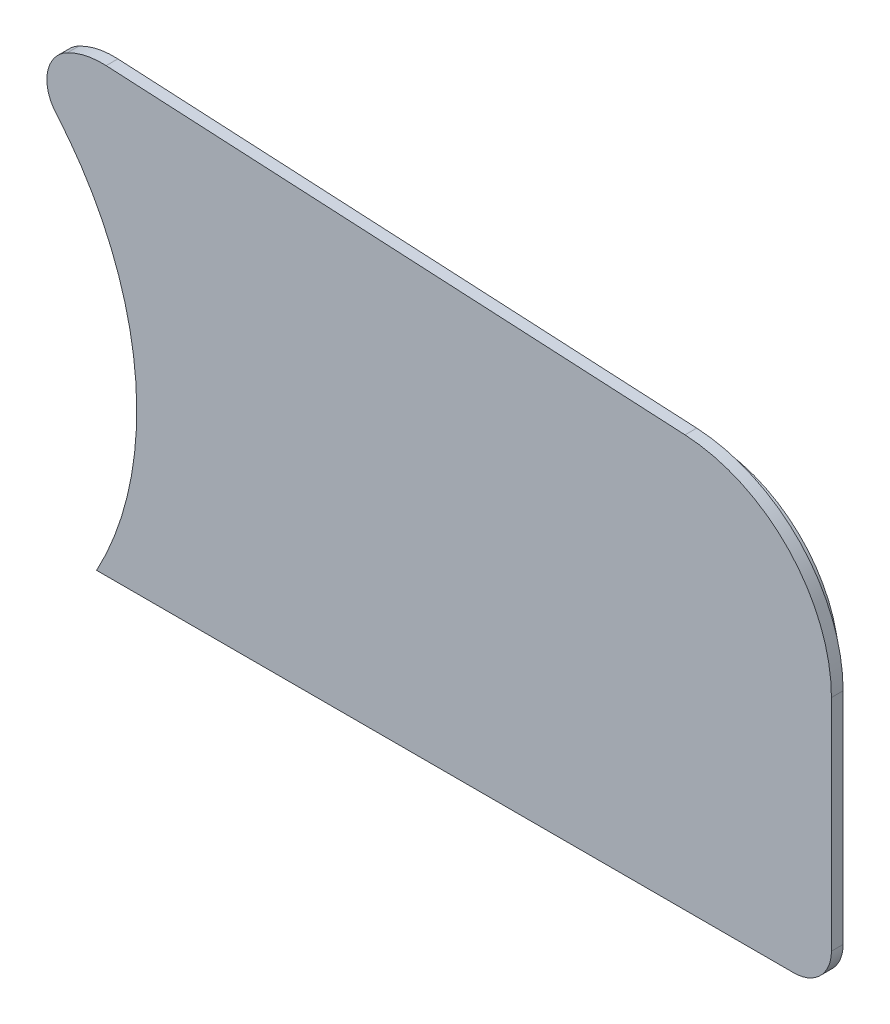
ISO-10303-21;
HEADER;
FILE_DESCRIPTION(('STEP AP214'),'2;1');
FILE_NAME('part.step','',(''),(''),'','','');
FILE_SCHEMA(('AUTOMOTIVE_DESIGN { 1 0 10303 214 1 1 1 1 }'));
ENDSEC;
DATA;
#1=APPLICATION_CONTEXT('core data for automotive mechanical design processes');
#2=APPLICATION_PROTOCOL_DEFINITION('international standard','automotive_design',2000,#1);
#3=PRODUCT_CONTEXT('',#1,'mechanical');
#4=PRODUCT('Part','Part','',(#3));
#5=PRODUCT_RELATED_PRODUCT_CATEGORY('part','',(#4));
#6=PRODUCT_DEFINITION_FORMATION('','',#4);
#7=PRODUCT_DEFINITION_CONTEXT('part definition',#1,'design');
#8=PRODUCT_DEFINITION('design','',#6,#7);
#9=PRODUCT_DEFINITION_SHAPE('','',#8);
#10=(LENGTH_UNIT() NAMED_UNIT(*) SI_UNIT(.MILLI.,.METRE.));
#11=(NAMED_UNIT(*) PLANE_ANGLE_UNIT() SI_UNIT($,.RADIAN.));
#12=(NAMED_UNIT(*) SI_UNIT($,.STERADIAN.) SOLID_ANGLE_UNIT());
#13=UNCERTAINTY_MEASURE_WITH_UNIT(LENGTH_MEASURE(1.E-05),#10,'distance_accuracy_value','');
#14=(GEOMETRIC_REPRESENTATION_CONTEXT(3) GLOBAL_UNCERTAINTY_ASSIGNED_CONTEXT((#13)) GLOBAL_UNIT_ASSIGNED_CONTEXT((#10,
#11,#12)) REPRESENTATION_CONTEXT('',''));
#15=CARTESIAN_POINT('',(0.,0.,0.));
#16=DIRECTION('',(0.,0.,1.));
#17=DIRECTION('',(1.,0.,0.));
#18=AXIS2_PLACEMENT_3D('',#15,#16,#17);
#19=CARTESIAN_POINT('',(-0.0206192370236305,-0.137475318792316,-1.5));
#20=DIRECTION('',(0.,0.,-1.));
#21=DIRECTION('',(-1.,0.,0.));
#22=AXIS2_PLACEMENT_3D('',#19,#20,#21);
#23=PLANE('',#22);
#24=CARTESIAN_POINT('',(-0.0206192370236305,-0.137475318792316,-1.5));
#25=DIRECTION('',(0.,0.,-1.));
#26=DIRECTION('',(-1.,0.,0.));
#27=AXIS2_PLACEMENT_3D('',#24,#25,#26);
#28=CIRCLE('',#27,46.1950000000043);
#29=CARTESIAN_POINT('',(44.436517290928,-12.6890105529967,-1.5));
#30=VERTEX_POINT('',#29);
#31=CARTESIAN_POINT('',(37.64579796516,26.6061041004149,-1.5));
#32=VERTEX_POINT('',#31);
#33=EDGE_CURVE('E206',#30,#32,#28,.F.);
#34=ORIENTED_EDGE('',*,*,#33,.T.);
#35=CARTESIAN_POINT('',(41.5799999999979,29.39943174836,-1.5));
#36=DIRECTION('',(0.,0.,-1.));
#37=DIRECTION('',(-1.,0.,0.));
#38=AXIS2_PLACEMENT_3D('',#35,#36,#37);
#39=CIRCLE('',#38,4.82499999996859);
#40=CARTESIAN_POINT('',(41.832520988868,34.2178192535195,-1.5));
#41=VERTEX_POINT('',#40);
#42=EDGE_CURVE('E203',#41,#32,#39,.F.);
#43=ORIENTED_EDGE('',*,*,#42,.F.);
#44=DIRECTION('',(-0.998629534754579,0.0523359562428546,0.));
#45=VECTOR('',#44,1.);
#46=CARTESIAN_POINT('',(41.832520988868,34.2178192535195,-1.5));
#47=LINE('',#46,#45);
#48=CARTESIAN_POINT('',(113.880552463786,30.4419419222108,-1.5));
#49=VERTEX_POINT('',#48);
#50=EDGE_CURVE('E132',#49,#41,#47,.T.);
#51=ORIENTED_EDGE('',*,*,#50,.F.);
#52=CARTESIAN_POINT('',(113.,13.6399999999651,-1.5));
#53=DIRECTION('',(0.,0.,-1.));
#54=DIRECTION('',(-1.,0.,0.));
#55=AXIS2_PLACEMENT_3D('',#52,#53,#54);
#56=CIRCLE('',#55,16.825);
#57=CARTESIAN_POINT('',(129.825,13.6399999999651,-1.5));
#58=VERTEX_POINT('',#57);
#59=EDGE_CURVE('E18',#58,#49,#56,.F.);
#60=ORIENTED_EDGE('',*,*,#59,.F.);
#61=DIRECTION('',(0.,1.,0.));
#62=VECTOR('',#61,1.);
#63=CARTESIAN_POINT('',(129.825,13.6399999999651,-1.5));
#64=LINE('',#63,#62);
#65=CARTESIAN_POINT('',(129.825,-14.0000000000155,-1.5));
#66=VERTEX_POINT('',#65);
#67=EDGE_CURVE('E129',#66,#58,#64,.T.);
#68=ORIENTED_EDGE('',*,*,#67,.F.);
#69=CARTESIAN_POINT('',(125.,-14.0000000000155,-1.5));
#70=DIRECTION('',(0.,0.,-1.));
#71=DIRECTION('',(-1.,0.,0.));
#72=AXIS2_PLACEMENT_3D('',#69,#70,#71);
#73=CIRCLE('',#72,4.825);
#74=CARTESIAN_POINT('',(125.,-18.8250000000155,-1.5));
#75=VERTEX_POINT('',#74);
#76=EDGE_CURVE('E142',#75,#66,#73,.F.);
#77=ORIENTED_EDGE('',*,*,#76,.F.);
#78=DIRECTION('',(1.,0.,0.));
#79=VECTOR('',#78,1.);
#80=CARTESIAN_POINT('',(125.,-18.8250000000155,-1.5));
#81=LINE('',#80,#79);
#82=CARTESIAN_POINT('',(49.0800000000382,-18.8250000000155,-1.5));
#83=VERTEX_POINT('',#82);
#84=EDGE_CURVE('E150',#83,#75,#81,.T.);
#85=ORIENTED_EDGE('',*,*,#84,.F.);
#86=CARTESIAN_POINT('',(49.0800000000382,-14.0000000000155,-1.5));
#87=DIRECTION('',(0.,0.,-1.));
#88=DIRECTION('',(-1.,0.,0.));
#89=AXIS2_PLACEMENT_3D('',#86,#87,#88);
#90=CIRCLE('',#89,4.82500000000002);
#91=EDGE_CURVE('E209',#30,#83,#90,.F.);
#92=ORIENTED_EDGE('',*,*,#91,.F.);
#93=EDGE_LOOP('',(#34,#43,#51,#60,#68,#77,#85,#92));
#94=FACE_BOUND('',#93,.T.);
#95=ADVANCED_FACE('F15',(#94),#23,.T.);
#96=CARTESIAN_POINT('',(113.,13.6399999999651,0.));
#97=DIRECTION('',(0.,0.,-1.));
#98=DIRECTION('',(-1.,0.,0.));
#99=AXIS2_PLACEMENT_3D('',#96,#97,#98);
#100=CYLINDRICAL_SURFACE('',#99,16.825);
#101=CARTESIAN_POINT('',(113.,13.6399999999651,0.));
#102=DIRECTION('',(0.,0.,-1.));
#103=DIRECTION('',(-1.,0.,0.));
#104=AXIS2_PLACEMENT_3D('',#101,#102,#103);
#105=CIRCLE('',#104,16.825);
#106=CARTESIAN_POINT('',(113.880552463786,30.4419419222108,0.));
#107=VERTEX_POINT('',#106);
#108=CARTESIAN_POINT('',(129.825,13.6399999999651,0.));
#109=VERTEX_POINT('',#108);
#110=EDGE_CURVE('E139',#107,#109,#105,.T.);
#111=ORIENTED_EDGE('',*,*,#110,.T.);
#112=DIRECTION('',(0.,0.,-1.));
#113=VECTOR('',#112,1.);
#114=CARTESIAN_POINT('',(129.825,13.6399999999651,0.));
#115=LINE('',#114,#113);
#116=EDGE_CURVE('E136',#58,#109,#115,.F.);
#117=ORIENTED_EDGE('',*,*,#116,.F.);
#118=ORIENTED_EDGE('',*,*,#59,.T.);
#119=DIRECTION('',(0.,0.,1.));
#120=VECTOR('',#119,1.);
#121=CARTESIAN_POINT('',(113.880552463786,30.4419419222108,0.));
#122=LINE('',#121,#120);
#123=EDGE_CURVE('E202',#107,#49,#122,.F.);
#124=ORIENTED_EDGE('',*,*,#123,.F.);
#125=EDGE_LOOP('',(#111,#117,#118,#124));
#126=FACE_BOUND('',#125,.T.);
#127=ADVANCED_FACE('F137',(#126),#100,.T.);
#128=CARTESIAN_POINT('',(129.825,13.6399999999651,0.));
#129=DIRECTION('',(1.,0.,0.));
#130=DIRECTION('',(0.,0.,-1.));
#131=AXIS2_PLACEMENT_3D('',#128,#129,#130);
#132=PLANE('',#131);
#133=DIRECTION('',(0.,1.,0.));
#134=VECTOR('',#133,1.);
#135=CARTESIAN_POINT('',(129.825,-2.89698820488127E-12,0.));
#136=LINE('',#135,#134);
#137=CARTESIAN_POINT('',(129.825,-14.0000000000155,0.));
#138=VERTEX_POINT('',#137);
#139=EDGE_CURVE('E200',#109,#138,#136,.F.);
#140=ORIENTED_EDGE('',*,*,#139,.T.);
#141=DIRECTION('',(0.,0.,-1.));
#142=VECTOR('',#141,1.);
#143=CARTESIAN_POINT('',(129.825,-14.0000000000155,0.));
#144=LINE('',#143,#142);
#145=EDGE_CURVE('E146',#66,#138,#144,.F.);
#146=ORIENTED_EDGE('',*,*,#145,.F.);
#147=ORIENTED_EDGE('',*,*,#67,.T.);
#148=ORIENTED_EDGE('',*,*,#116,.T.);
#149=EDGE_LOOP('',(#140,#146,#147,#148));
#150=FACE_BOUND('',#149,.T.);
#151=ADVANCED_FACE('F144',(#150),#132,.T.);
#152=CARTESIAN_POINT('',(125.,-14.0000000000155,0.));
#153=DIRECTION('',(0.,0.,-1.));
#154=DIRECTION('',(-1.,0.,0.));
#155=AXIS2_PLACEMENT_3D('',#152,#153,#154);
#156=CYLINDRICAL_SURFACE('',#155,4.825);
#157=CARTESIAN_POINT('',(125.,-14.0000000000155,0.));
#158=DIRECTION('',(0.,0.,-1.));
#159=DIRECTION('',(-1.,0.,0.));
#160=AXIS2_PLACEMENT_3D('',#157,#158,#159);
#161=CIRCLE('',#160,4.825);
#162=CARTESIAN_POINT('',(125.,-18.8250000000155,0.));
#163=VERTEX_POINT('',#162);
#164=EDGE_CURVE('E198',#138,#163,#161,.T.);
#165=ORIENTED_EDGE('',*,*,#164,.T.);
#166=DIRECTION('',(0.,0.,-1.));
#167=VECTOR('',#166,1.);
#168=CARTESIAN_POINT('',(125.,-18.8250000000155,0.));
#169=LINE('',#168,#167);
#170=EDGE_CURVE('E216',#75,#163,#169,.F.);
#171=ORIENTED_EDGE('',*,*,#170,.F.);
#172=ORIENTED_EDGE('',*,*,#76,.T.);
#173=ORIENTED_EDGE('',*,*,#145,.T.);
#174=EDGE_LOOP('',(#165,#171,#172,#173));
#175=FACE_BOUND('',#174,.T.);
#176=ADVANCED_FACE('F400',(#175),#156,.T.);
#177=CARTESIAN_POINT('',(125.,-18.8250000000155,0.));
#178=DIRECTION('',(0.,-1.,0.));
#179=DIRECTION('',(0.,0.,-1.));
#180=AXIS2_PLACEMENT_3D('',#177,#178,#179);
#181=PLANE('',#180);
#182=DIRECTION('',(1.,0.,0.));
#183=VECTOR('',#182,1.);
#184=CARTESIAN_POINT('',(5.26662047306559E-12,-18.8250000000155,0.));
#185=LINE('',#184,#183);
#186=CARTESIAN_POINT('',(49.0800000000382,-18.8250000000155,0.));
#187=VERTEX_POINT('',#186);
#188=EDGE_CURVE('E197',#163,#187,#185,.F.);
#189=ORIENTED_EDGE('',*,*,#188,.T.);
#190=DIRECTION('',(0.,0.,-1.));
#191=VECTOR('',#190,1.);
#192=CARTESIAN_POINT('',(49.0800000000382,-18.8250000000155,0.));
#193=LINE('',#192,#191);
#194=EDGE_CURVE('E210',#83,#187,#193,.F.);
#195=ORIENTED_EDGE('',*,*,#194,.F.);
#196=ORIENTED_EDGE('',*,*,#84,.T.);
#197=ORIENTED_EDGE('',*,*,#170,.T.);
#198=EDGE_LOOP('',(#189,#195,#196,#197));
#199=FACE_BOUND('',#198,.T.);
#200=ADVANCED_FACE('F241',(#199),#181,.T.);
#201=CARTESIAN_POINT('',(49.0800000000382,-14.0000000000155,0.));
#202=DIRECTION('',(0.,0.,-1.));
#203=DIRECTION('',(-1.,0.,0.));
#204=AXIS2_PLACEMENT_3D('',#201,#202,#203);
#205=CYLINDRICAL_SURFACE('',#204,4.82500000000002);
#206=DIRECTION('',(0.,0.,-1.));
#207=VECTOR('',#206,1.);
#208=CARTESIAN_POINT('',(44.436517290928,-12.6890105529967,0.));
#209=LINE('',#208,#207);
#210=CARTESIAN_POINT('',(44.436517290928,-12.6890105529967,0.));
#211=VERTEX_POINT('',#210);
#212=EDGE_CURVE('E208',#211,#30,#209,.T.);
#213=ORIENTED_EDGE('',*,*,#212,.T.);
#214=ORIENTED_EDGE('',*,*,#91,.T.);
#215=ORIENTED_EDGE('',*,*,#194,.T.);
#216=CARTESIAN_POINT('',(49.0800000000382,-14.0000000000155,0.));
#217=DIRECTION('',(0.,0.,-1.));
#218=DIRECTION('',(-1.,0.,0.));
#219=AXIS2_PLACEMENT_3D('',#216,#217,#218);
#220=CIRCLE('',#219,4.82500000000002);
#221=EDGE_CURVE('E195',#187,#211,#220,.T.);
#222=ORIENTED_EDGE('',*,*,#221,.T.);
#223=EDGE_LOOP('',(#213,#214,#215,#222));
#224=FACE_BOUND('',#223,.T.);
#225=ADVANCED_FACE('F386',(#224),#205,.T.);
#226=CARTESIAN_POINT('',(-0.0206192370236305,-0.137475318792316,0.));
#227=DIRECTION('',(0.,0.,-1.));
#228=DIRECTION('',(-1.,0.,0.));
#229=AXIS2_PLACEMENT_3D('',#226,#227,#228);
#230=CYLINDRICAL_SURFACE('',#229,46.1950000000043);
#231=ORIENTED_EDGE('',*,*,#212,.F.);
#232=CARTESIAN_POINT('',(-0.0206192370236305,-0.137475318792316,0.));
#233=DIRECTION('',(0.,0.,-1.));
#234=DIRECTION('',(-1.,0.,0.));
#235=AXIS2_PLACEMENT_3D('',#232,#233,#234);
#236=CIRCLE('',#235,46.1950000000043);
#237=CARTESIAN_POINT('',(37.64579796516,26.6061041004149,0.));
#238=VERTEX_POINT('',#237);
#239=EDGE_CURVE('E192',#211,#238,#236,.F.);
#240=ORIENTED_EDGE('',*,*,#239,.T.);
#241=DIRECTION('',(0.,0.,-1.));
#242=VECTOR('',#241,1.);
#243=CARTESIAN_POINT('',(37.64579796516,26.6061041004149,0.));
#244=LINE('',#243,#242);
#245=EDGE_CURVE('E205',#32,#238,#244,.F.);
#246=ORIENTED_EDGE('',*,*,#245,.F.);
#247=ORIENTED_EDGE('',*,*,#33,.F.);
#248=EDGE_LOOP('',(#231,#240,#246,#247));
#249=FACE_BOUND('',#248,.T.);
#250=ADVANCED_FACE('F378',(#249),#230,.F.);
#251=CARTESIAN_POINT('',(41.5799999999979,29.39943174836,0.));
#252=DIRECTION('',(0.,0.,-1.));
#253=DIRECTION('',(-1.,0.,0.));
#254=AXIS2_PLACEMENT_3D('',#251,#252,#253);
#255=CYLINDRICAL_SURFACE('',#254,4.82499999996859);
#256=DIRECTION('',(0.,0.,1.));
#257=VECTOR('',#256,1.);
#258=CARTESIAN_POINT('',(41.832520988868,34.2178192535195,0.));
#259=LINE('',#258,#257);
#260=CARTESIAN_POINT('',(41.832520988868,34.2178192535195,0.));
#261=VERTEX_POINT('',#260);
#262=EDGE_CURVE('E219',#41,#261,#259,.T.);
#263=ORIENTED_EDGE('',*,*,#262,.F.);
#264=ORIENTED_EDGE('',*,*,#42,.T.);
#265=ORIENTED_EDGE('',*,*,#245,.T.);
#266=CARTESIAN_POINT('',(41.5799999999979,29.39943174836,0.));
#267=DIRECTION('',(0.,0.,-1.));
#268=DIRECTION('',(-1.,0.,0.));
#269=AXIS2_PLACEMENT_3D('',#266,#267,#268);
#270=CIRCLE('',#269,4.82499999996859);
#271=EDGE_CURVE('E189',#238,#261,#270,.T.);
#272=ORIENTED_EDGE('',*,*,#271,.T.);
#273=EDGE_LOOP('',(#263,#264,#265,#272));
#274=FACE_BOUND('',#273,.T.);
#275=ADVANCED_FACE('F371',(#274),#255,.T.);
#276=CARTESIAN_POINT('',(41.832520988868,34.2178192535195,0.));
#277=DIRECTION('',(0.0523359562428546,0.998629534754579,0.));
#278=DIRECTION('',(-0.998629534754579,0.0523359562428546,0.));
#279=AXIS2_PLACEMENT_3D('',#276,#277,#278);
#280=PLANE('',#279);
#281=DIRECTION('',(0.998629534754579,-0.0523359562428545,0.));
#282=VECTOR('',#281,1.);
#283=CARTESIAN_POINT('',(41.832520988868,34.2178192535195,0.));
#284=LINE('',#283,#282);
#285=EDGE_CURVE('E191',#261,#107,#284,.T.);
#286=ORIENTED_EDGE('',*,*,#285,.T.);
#287=ORIENTED_EDGE('',*,*,#123,.T.);
#288=ORIENTED_EDGE('',*,*,#50,.T.);
#289=ORIENTED_EDGE('',*,*,#262,.T.);
#290=EDGE_LOOP('',(#286,#287,#288,#289));
#291=FACE_BOUND('',#290,.T.);
#292=ADVANCED_FACE('F364',(#291),#280,.T.);
#293=CARTESIAN_POINT('',(5.26662047306559E-12,-2.89698820488127E-12,0.));
#294=DIRECTION('',(0.,0.,1.));
#295=DIRECTION('',(1.,0.,0.));
#296=AXIS2_PLACEMENT_3D('',#293,#294,#295);
#297=PLANE('',#296);
#298=DIRECTION('',(0.,1.,0.));
#299=VECTOR('',#298,1.);
#300=CARTESIAN_POINT('',(131.825000000003,12.691035433275,0.));
#301=LINE('',#300,#299);
#302=CARTESIAN_POINT('',(131.825000000003,-15.5,0.));
#303=VERTEX_POINT('',#302);
#304=CARTESIAN_POINT('',(131.825000000003,12.691035433275,0.));
#305=VERTEX_POINT('',#304);
#306=EDGE_CURVE('E188',#303,#305,#301,.T.);
#307=ORIENTED_EDGE('',*,*,#306,.F.);
#308=CARTESIAN_POINT('',(127.000000000003,-15.5,0.));
#309=DIRECTION('',(0.,0.,-1.));
#310=DIRECTION('',(-1.,0.,0.));
#311=AXIS2_PLACEMENT_3D('',#308,#309,#310);
#312=CIRCLE('',#311,4.825);
#313=CARTESIAN_POINT('',(127.000000000003,-20.325,0.));
#314=VERTEX_POINT('',#313);
#315=EDGE_CURVE('E166',#314,#303,#312,.F.);
#316=ORIENTED_EDGE('',*,*,#315,.F.);
#317=DIRECTION('',(1.,0.,0.));
#318=VECTOR('',#317,1.);
#319=CARTESIAN_POINT('',(127.000000000003,-20.325,0.));
#320=LINE('',#319,#318);
#321=CARTESIAN_POINT('',(37.5239923249249,-20.325,0.));
#322=VERTEX_POINT('',#321);
#323=EDGE_CURVE('E174',#322,#314,#320,.T.);
#324=ORIENTED_EDGE('',*,*,#323,.F.);
#325=CARTESIAN_POINT('',(5.26662047306559E-12,-2.89698820488127E-12,0.));
#326=DIRECTION('',(0.,0.,-1.));
#327=DIRECTION('',(-1.,0.,0.));
#328=AXIS2_PLACEMENT_3D('',#325,#326,#327);
#329=CIRCLE('',#328,42.675000000006);
#330=CARTESIAN_POINT('',(32.313585027076,27.8745017479887,0.));
#331=VERTEX_POINT('',#330);
#332=EDGE_CURVE('E171',#322,#331,#329,.F.);
#333=ORIENTED_EDGE('',*,*,#332,.T.);
#334=CARTESIAN_POINT('',(35.9670835099253,31.0261003639006,0.));
#335=DIRECTION('',(0.,0.,-1.));
#336=DIRECTION('',(-1.,0.,0.));
#337=AXIS2_PLACEMENT_3D('',#334,#335,#336);
#338=CIRCLE('',#337,4.82500000000001);
#339=CARTESIAN_POINT('',(33.7775339052753,35.3256930805166,0.));
#340=VERTEX_POINT('',#339);
#341=EDGE_CURVE('E176',#340,#331,#338,.F.);
#342=ORIENTED_EDGE('',*,*,#341,.F.);
#343=CARTESIAN_POINT('',(38.2360468308027,26.5705638700047,0.));
#344=DIRECTION('',(0.,0.,-1.));
#345=DIRECTION('',(-1.,0.,0.));
#346=AXIS2_PLACEMENT_3D('',#343,#344,#345);
#347=CIRCLE('',#346,9.82499999999254);
#348=CARTESIAN_POINT('',(38.7502476008901,36.3820990489609,0.));
#349=VERTEX_POINT('',#348);
#350=EDGE_CURVE('E179',#349,#340,#347,.F.);
#351=ORIENTED_EDGE('',*,*,#350,.F.);
#352=DIRECTION('',(-0.998629534754569,0.0523359562430371,0.));
#353=VECTOR('',#352,1.);
#354=CARTESIAN_POINT('',(38.7502476008901,36.3820990489609,0.));
#355=LINE('',#354,#353);
#356=CARTESIAN_POINT('',(113.037560332521,32.4888659597843,0.));
#357=VERTEX_POINT('',#356);
#358=EDGE_CURVE('E228',#357,#349,#355,.T.);
#359=ORIENTED_EDGE('',*,*,#358,.F.);
#360=CARTESIAN_POINT('',(112.000000000003,12.691035433275,0.));
#361=DIRECTION('',(0.,0.,-1.));
#362=DIRECTION('',(-1.,0.,0.));
#363=AXIS2_PLACEMENT_3D('',#360,#361,#362);
#364=CIRCLE('',#363,19.825);
#365=EDGE_CURVE('E184',#305,#357,#364,.F.);
#366=ORIENTED_EDGE('',*,*,#365,.F.);
#367=EDGE_LOOP('',(#307,#316,#324,#333,#342,#351,#359,#366));
#368=FACE_BOUND('',#367,.T.);
#369=ORIENTED_EDGE('',*,*,#271,.F.);
#370=ORIENTED_EDGE('',*,*,#239,.F.);
#371=ORIENTED_EDGE('',*,*,#221,.F.);
#372=ORIENTED_EDGE('',*,*,#188,.F.);
#373=ORIENTED_EDGE('',*,*,#164,.F.);
#374=ORIENTED_EDGE('',*,*,#139,.F.);
#375=ORIENTED_EDGE('',*,*,#110,.F.);
#376=ORIENTED_EDGE('',*,*,#285,.F.);
#377=EDGE_LOOP('',(#369,#370,#371,#372,#373,#374,#375,#376));
#378=FACE_BOUND('',#377,.T.);
#379=ADVANCED_FACE('F244',(#368,#378),#297,.F.);
#380=CARTESIAN_POINT('',(131.825000000003,12.691035433275,1.5));
#381=DIRECTION('',(1.,0.,0.));
#382=DIRECTION('',(0.,1.,0.));
#383=AXIS2_PLACEMENT_3D('',#380,#381,#382);
#384=PLANE('',#383);
#385=DIRECTION('',(0.,1.,0.));
#386=VECTOR('',#385,1.);
#387=CARTESIAN_POINT('',(131.825000000003,-2.89698820488127E-12,1.5));
#388=LINE('',#387,#386);
#389=CARTESIAN_POINT('',(131.825000000003,-15.5,1.5));
#390=VERTEX_POINT('',#389);
#391=CARTESIAN_POINT('',(131.825000000003,12.691035433275,1.5));
#392=VERTEX_POINT('',#391);
#393=EDGE_CURVE('E165',#390,#392,#388,.T.);
#394=ORIENTED_EDGE('',*,*,#393,.F.);
#395=DIRECTION('',(0.,0.,-1.));
#396=VECTOR('',#395,1.);
#397=CARTESIAN_POINT('',(131.825000000003,-15.5,1.5));
#398=LINE('',#397,#396);
#399=EDGE_CURVE('E169',#303,#390,#398,.F.);
#400=ORIENTED_EDGE('',*,*,#399,.F.);
#401=ORIENTED_EDGE('',*,*,#306,.T.);
#402=DIRECTION('',(0.,0.,-1.));
#403=VECTOR('',#402,1.);
#404=CARTESIAN_POINT('',(131.825000000003,12.691035433275,1.5));
#405=LINE('',#404,#403);
#406=EDGE_CURVE('E187',#392,#305,#405,.T.);
#407=ORIENTED_EDGE('',*,*,#406,.F.);
#408=EDGE_LOOP('',(#394,#400,#401,#407));
#409=FACE_BOUND('',#408,.T.);
#410=ADVANCED_FACE('F285',(#409),#384,.T.);
#411=CARTESIAN_POINT('',(112.000000000003,12.691035433275,1.5));
#412=DIRECTION('',(0.,0.,-1.));
#413=DIRECTION('',(-1.,0.,0.));
#414=AXIS2_PLACEMENT_3D('',#411,#412,#413);
#415=CYLINDRICAL_SURFACE('',#414,19.825);
#416=CARTESIAN_POINT('',(112.000000000003,12.691035433275,1.5));
#417=DIRECTION('',(0.,0.,-1.));
#418=DIRECTION('',(-1.,0.,0.));
#419=AXIS2_PLACEMENT_3D('',#416,#417,#418);
#420=CIRCLE('',#419,19.825);
#421=CARTESIAN_POINT('',(113.037560332521,32.4888659597843,1.5));
#422=VERTEX_POINT('',#421);
#423=EDGE_CURVE('E162',#392,#422,#420,.F.);
#424=ORIENTED_EDGE('',*,*,#423,.F.);
#425=ORIENTED_EDGE('',*,*,#406,.T.);
#426=ORIENTED_EDGE('',*,*,#365,.T.);
#427=DIRECTION('',(0.,0.,1.));
#428=VECTOR('',#427,1.);
#429=CARTESIAN_POINT('',(113.037560332521,32.4888659597843,1.5));
#430=LINE('',#429,#428);
#431=EDGE_CURVE('E183',#422,#357,#430,.F.);
#432=ORIENTED_EDGE('',*,*,#431,.F.);
#433=EDGE_LOOP('',(#424,#425,#426,#432));
#434=FACE_BOUND('',#433,.T.);
#435=ADVANCED_FACE('F289',(#434),#415,.T.);
#436=CARTESIAN_POINT('',(38.7502476008901,36.3820990489609,1.5));
#437=DIRECTION('',(0.0523359562430371,0.998629534754569,0.));
#438=DIRECTION('',(-0.998629534754569,0.0523359562430371,0.));
#439=AXIS2_PLACEMENT_3D('',#436,#437,#438);
#440=PLANE('',#439);
#441=DIRECTION('',(-0.998629534754569,0.0523359562430371,0.));
#442=VECTOR('',#441,1.);
#443=CARTESIAN_POINT('',(113.037560332521,32.4888659597843,1.5));
#444=LINE('',#443,#442);
#445=CARTESIAN_POINT('',(38.7502476008901,36.3820990489609,1.5));
#446=VERTEX_POINT('',#445);
#447=EDGE_CURVE('E161',#422,#446,#444,.T.);
#448=ORIENTED_EDGE('',*,*,#447,.F.);
#449=ORIENTED_EDGE('',*,*,#431,.T.);
#450=ORIENTED_EDGE('',*,*,#358,.T.);
#451=DIRECTION('',(0.,0.,-1.));
#452=VECTOR('',#451,1.);
#453=CARTESIAN_POINT('',(38.7502476008901,36.3820990489609,1.5));
#454=LINE('',#453,#452);
#455=EDGE_CURVE('E182',#446,#349,#454,.T.);
#456=ORIENTED_EDGE('',*,*,#455,.F.);
#457=EDGE_LOOP('',(#448,#449,#450,#456));
#458=FACE_BOUND('',#457,.T.);
#459=ADVANCED_FACE('F292',(#458),#440,.T.);
#460=CARTESIAN_POINT('',(38.2360468308027,26.5705638700047,1.5));
#461=DIRECTION('',(0.,0.,-1.));
#462=DIRECTION('',(-1.,0.,0.));
#463=AXIS2_PLACEMENT_3D('',#460,#461,#462);
#464=CYLINDRICAL_SURFACE('',#463,9.82499999999254);
#465=CARTESIAN_POINT('',(38.2360468308027,26.5705638700047,1.5));
#466=DIRECTION('',(0.,0.,-1.));
#467=DIRECTION('',(-1.,0.,0.));
#468=AXIS2_PLACEMENT_3D('',#465,#466,#467);
#469=CIRCLE('',#468,9.82499999999254);
#470=CARTESIAN_POINT('',(33.7775339052753,35.3256930805166,1.5));
#471=VERTEX_POINT('',#470);
#472=EDGE_CURVE('E158',#446,#471,#469,.F.);
#473=ORIENTED_EDGE('',*,*,#472,.F.);
#474=ORIENTED_EDGE('',*,*,#455,.T.);
#475=ORIENTED_EDGE('',*,*,#350,.T.);
#476=DIRECTION('',(0.,0.,-1.));
#477=VECTOR('',#476,1.);
#478=CARTESIAN_POINT('',(33.7775339052753,35.3256930805166,1.5));
#479=LINE('',#478,#477);
#480=EDGE_CURVE('E178',#471,#340,#479,.T.);
#481=ORIENTED_EDGE('',*,*,#480,.F.);
#482=EDGE_LOOP('',(#473,#474,#475,#481));
#483=FACE_BOUND('',#482,.T.);
#484=ADVANCED_FACE('F295',(#483),#464,.T.);
#485=CARTESIAN_POINT('',(35.9670835099253,31.0261003639006,1.5));
#486=DIRECTION('',(0.,0.,-1.));
#487=DIRECTION('',(-1.,0.,0.));
#488=AXIS2_PLACEMENT_3D('',#485,#486,#487);
#489=CYLINDRICAL_SURFACE('',#488,4.82500000000001);
#490=ORIENTED_EDGE('',*,*,#341,.T.);
#491=DIRECTION('',(0.,0.,-1.));
#492=VECTOR('',#491,1.);
#493=CARTESIAN_POINT('',(32.313585027076,27.8745017479887,1.5));
#494=LINE('',#493,#492);
#495=CARTESIAN_POINT('',(32.313585027076,27.8745017479887,1.5));
#496=VERTEX_POINT('',#495);
#497=EDGE_CURVE('E175',#331,#496,#494,.F.);
#498=ORIENTED_EDGE('',*,*,#497,.T.);
#499=CARTESIAN_POINT('',(35.9670835099253,31.0261003639006,1.5));
#500=DIRECTION('',(0.,0.,-1.));
#501=DIRECTION('',(-1.,0.,0.));
#502=AXIS2_PLACEMENT_3D('',#499,#500,#501);
#503=CIRCLE('',#502,4.82500000000001);
#504=EDGE_CURVE('E156',#471,#496,#503,.F.);
#505=ORIENTED_EDGE('',*,*,#504,.F.);
#506=ORIENTED_EDGE('',*,*,#480,.T.);
#507=EDGE_LOOP('',(#490,#498,#505,#506));
#508=FACE_BOUND('',#507,.T.);
#509=ADVANCED_FACE('F298',(#508),#489,.T.);
#510=CARTESIAN_POINT('',(5.26662047306559E-12,-2.89698820488127E-12,1.5));
#511=DIRECTION('',(0.,0.,-1.));
#512=DIRECTION('',(-1.,0.,0.));
#513=AXIS2_PLACEMENT_3D('',#510,#511,#512);
#514=CYLINDRICAL_SURFACE('',#513,42.675000000006);
#515=DIRECTION('',(0.,0.,1.));
#516=VECTOR('',#515,1.);
#517=CARTESIAN_POINT('',(37.5239923249249,-20.325,1.5));
#518=LINE('',#517,#516);
#519=CARTESIAN_POINT('',(37.5239923249249,-20.325,1.5));
#520=VERTEX_POINT('',#519);
#521=EDGE_CURVE('E170',#520,#322,#518,.F.);
#522=ORIENTED_EDGE('',*,*,#521,.F.);
#523=CARTESIAN_POINT('',(5.26662047306559E-12,-2.89698820488127E-12,1.5));
#524=DIRECTION('',(0.,0.,-1.));
#525=DIRECTION('',(-1.,0.,0.));
#526=AXIS2_PLACEMENT_3D('',#523,#524,#525);
#527=CIRCLE('',#526,42.675000000006);
#528=EDGE_CURVE('E153',#496,#520,#527,.T.);
#529=ORIENTED_EDGE('',*,*,#528,.F.);
#530=ORIENTED_EDGE('',*,*,#497,.F.);
#531=ORIENTED_EDGE('',*,*,#332,.F.);
#532=EDGE_LOOP('',(#522,#529,#530,#531));
#533=FACE_BOUND('',#532,.T.);
#534=ADVANCED_FACE('F280',(#533),#514,.F.);
#535=CARTESIAN_POINT('',(127.000000000003,-20.325,1.5));
#536=DIRECTION('',(0.,-1.,0.));
#537=DIRECTION('',(1.,0.,0.));
#538=AXIS2_PLACEMENT_3D('',#535,#536,#537);
#539=PLANE('',#538);
#540=DIRECTION('',(1.,0.,0.));
#541=VECTOR('',#540,1.);
#542=CARTESIAN_POINT('',(5.26662047306559E-12,-20.325,1.5));
#543=LINE('',#542,#541);
#544=CARTESIAN_POINT('',(127.000000000003,-20.325,1.5));
#545=VERTEX_POINT('',#544);
#546=EDGE_CURVE('E24',#520,#545,#543,.T.);
#547=ORIENTED_EDGE('',*,*,#546,.F.);
#548=ORIENTED_EDGE('',*,*,#521,.T.);
#549=ORIENTED_EDGE('',*,*,#323,.T.);
#550=DIRECTION('',(0.,0.,-1.));
#551=VECTOR('',#550,1.);
#552=CARTESIAN_POINT('',(127.000000000003,-20.325,1.5));
#553=LINE('',#552,#551);
#554=EDGE_CURVE('E33',#545,#314,#553,.T.);
#555=ORIENTED_EDGE('',*,*,#554,.F.);
#556=EDGE_LOOP('',(#547,#548,#549,#555));
#557=FACE_BOUND('',#556,.T.);
#558=ADVANCED_FACE('F277',(#557),#539,.T.);
#559=CARTESIAN_POINT('',(127.000000000003,-15.5,1.5));
#560=DIRECTION('',(0.,0.,-1.));
#561=DIRECTION('',(-1.,0.,0.));
#562=AXIS2_PLACEMENT_3D('',#559,#560,#561);
#563=CYLINDRICAL_SURFACE('',#562,4.825);
#564=CARTESIAN_POINT('',(127.000000000003,-15.5,1.5));
#565=DIRECTION('',(0.,0.,-1.));
#566=DIRECTION('',(-1.,0.,0.));
#567=AXIS2_PLACEMENT_3D('',#564,#565,#566);
#568=CIRCLE('',#567,4.825);
#569=EDGE_CURVE('E9',#545,#390,#568,.F.);
#570=ORIENTED_EDGE('',*,*,#569,.F.);
#571=ORIENTED_EDGE('',*,*,#554,.T.);
#572=ORIENTED_EDGE('',*,*,#315,.T.);
#573=ORIENTED_EDGE('',*,*,#399,.T.);
#574=EDGE_LOOP('',(#570,#571,#572,#573));
#575=FACE_BOUND('',#574,.T.);
#576=ADVANCED_FACE('F284',(#575),#563,.T.);
#577=CARTESIAN_POINT('',(5.26662047306559E-12,-2.89698820488127E-12,1.5));
#578=DIRECTION('',(0.,0.,1.));
#579=DIRECTION('',(1.,0.,0.));
#580=AXIS2_PLACEMENT_3D('',#577,#578,#579);
#581=PLANE('',#580);
#582=ORIENTED_EDGE('',*,*,#546,.T.);
#583=ORIENTED_EDGE('',*,*,#569,.T.);
#584=ORIENTED_EDGE('',*,*,#393,.T.);
#585=ORIENTED_EDGE('',*,*,#423,.T.);
#586=ORIENTED_EDGE('',*,*,#447,.T.);
#587=ORIENTED_EDGE('',*,*,#472,.T.);
#588=ORIENTED_EDGE('',*,*,#504,.T.);
#589=ORIENTED_EDGE('',*,*,#528,.T.);
#590=EDGE_LOOP('',(#582,#583,#584,#585,#586,#587,#588,#589));
#591=FACE_BOUND('',#590,.T.);
#592=ADVANCED_FACE('F275',(#591),#581,.T.);
#593=CLOSED_SHELL('',(#95,#127,#151,#176,#200,#225,#250,#275,#292,#379,#410,#435,#459,#484,#509,
#534,#558,#576,#592));
#594=MANIFOLD_SOLID_BREP('B1',#593);
#595=ADVANCED_BREP_SHAPE_REPRESENTATION('',(#18,#594),#14);
#596=SHAPE_DEFINITION_REPRESENTATION(#9,#595);
ENDSEC;
END-ISO-10303-21;
